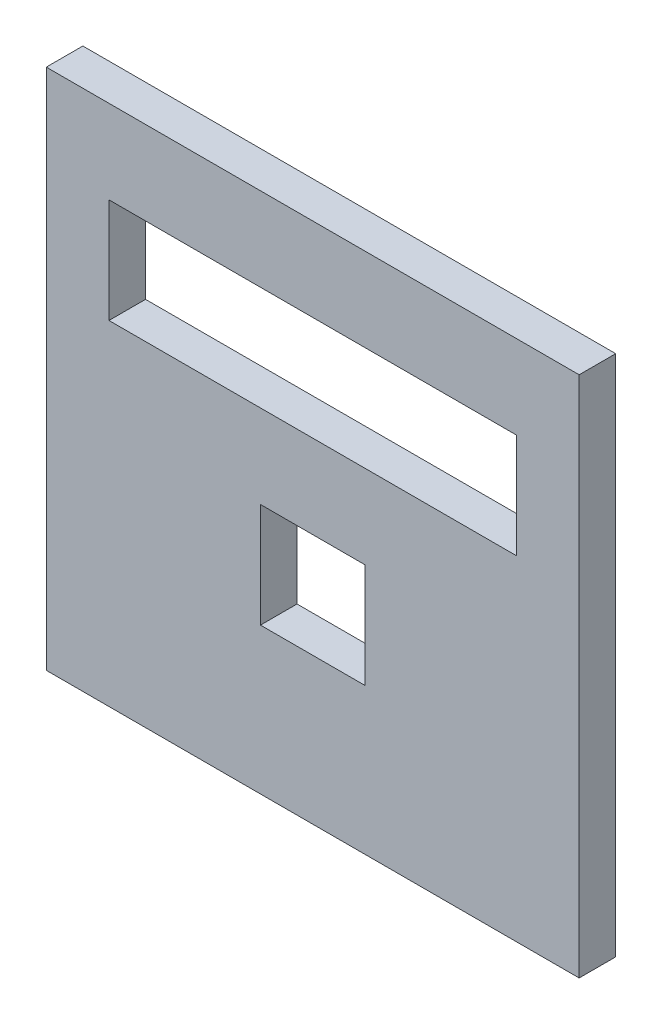
ISO-10303-21;
HEADER;
FILE_DESCRIPTION(('STEP AP214'),'2;1');
FILE_NAME('part.step','',(''),(''),'','','');
FILE_SCHEMA(('AUTOMOTIVE_DESIGN { 1 0 10303 214 1 1 1 1 }'));
ENDSEC;
DATA;
#1=APPLICATION_CONTEXT('core data for automotive mechanical design processes');
#2=APPLICATION_PROTOCOL_DEFINITION('international standard','automotive_design',2000,#1);
#3=PRODUCT_CONTEXT('',#1,'mechanical');
#4=PRODUCT('Part','Part','',(#3));
#5=PRODUCT_RELATED_PRODUCT_CATEGORY('part','',(#4));
#6=PRODUCT_DEFINITION_FORMATION('','',#4);
#7=PRODUCT_DEFINITION_CONTEXT('part definition',#1,'design');
#8=PRODUCT_DEFINITION('design','',#6,#7);
#9=PRODUCT_DEFINITION_SHAPE('','',#8);
#10=(LENGTH_UNIT() NAMED_UNIT(*) SI_UNIT(.MILLI.,.METRE.));
#11=(NAMED_UNIT(*) PLANE_ANGLE_UNIT() SI_UNIT($,.RADIAN.));
#12=(NAMED_UNIT(*) SI_UNIT($,.STERADIAN.) SOLID_ANGLE_UNIT());
#13=UNCERTAINTY_MEASURE_WITH_UNIT(LENGTH_MEASURE(1.E-05),#10,'distance_accuracy_value','');
#14=(GEOMETRIC_REPRESENTATION_CONTEXT(3) GLOBAL_UNCERTAINTY_ASSIGNED_CONTEXT((#13)) GLOBAL_UNIT_ASSIGNED_CONTEXT((#10,
#11,#12)) REPRESENTATION_CONTEXT('',''));
#15=CARTESIAN_POINT('',(0.,0.,0.));
#16=DIRECTION('',(0.,0.,1.));
#17=DIRECTION('',(1.,0.,0.));
#18=AXIS2_PLACEMENT_3D('',#15,#16,#17);
#19=CARTESIAN_POINT('',(0.,0.,1.75));
#20=DIRECTION('',(0.,0.,1.));
#21=DIRECTION('',(1.,0.,0.));
#22=AXIS2_PLACEMENT_3D('',#19,#20,#21);
#23=PLANE('',#22);
#24=DIRECTION('',(0.,1.,0.));
#25=VECTOR('',#24,1.);
#26=CARTESIAN_POINT('',(12.75,10.,1.75));
#27=LINE('',#26,#25);
#28=CARTESIAN_POINT('',(12.75,-10.,1.75));
#29=VERTEX_POINT('',#28);
#30=CARTESIAN_POINT('',(12.75,15.,1.75));
#31=VERTEX_POINT('',#30);
#32=EDGE_CURVE('E193',#29,#31,#27,.T.);
#33=ORIENTED_EDGE('',*,*,#32,.T.);
#34=DIRECTION('',(-1.,0.,0.));
#35=VECTOR('',#34,1.);
#36=CARTESIAN_POINT('',(12.75,15.,1.75));
#37=LINE('',#36,#35);
#38=CARTESIAN_POINT('',(-12.75,15.,1.75));
#39=VERTEX_POINT('',#38);
#40=EDGE_CURVE('E196',#31,#39,#37,.T.);
#41=ORIENTED_EDGE('',*,*,#40,.T.);
#42=DIRECTION('',(0.,-1.,0.));
#43=VECTOR('',#42,1.);
#44=CARTESIAN_POINT('',(-12.75,10.,1.75));
#45=LINE('',#44,#43);
#46=CARTESIAN_POINT('',(-12.75,-10.,1.75));
#47=VERTEX_POINT('',#46);
#48=EDGE_CURVE('E199',#39,#47,#45,.T.);
#49=ORIENTED_EDGE('',*,*,#48,.T.);
#50=DIRECTION('',(1.,0.,0.));
#51=VECTOR('',#50,1.);
#52=CARTESIAN_POINT('',(-12.75,-10.,1.75));
#53=LINE('',#52,#51);
#54=EDGE_CURVE('E201',#47,#29,#53,.T.);
#55=ORIENTED_EDGE('',*,*,#54,.T.);
#56=EDGE_LOOP('',(#33,#41,#49,#55));
#57=FACE_BOUND('',#56,.T.);
#58=DIRECTION('',(-1.,0.,0.));
#59=VECTOR('',#58,1.);
#60=CARTESIAN_POINT('',(-2.5,2.,1.75));
#61=LINE('',#60,#59);
#62=CARTESIAN_POINT('',(2.5,2.,1.75));
#63=VERTEX_POINT('',#62);
#64=CARTESIAN_POINT('',(-2.5,2.,1.75));
#65=VERTEX_POINT('',#64);
#66=EDGE_CURVE('E164',#63,#65,#61,.T.);
#67=ORIENTED_EDGE('',*,*,#66,.F.);
#68=DIRECTION('',(0.,1.,0.));
#69=VECTOR('',#68,1.);
#70=CARTESIAN_POINT('',(2.50000000000001,-3.,1.75));
#71=LINE('',#70,#69);
#72=CARTESIAN_POINT('',(2.50000000000001,-3.,1.75));
#73=VERTEX_POINT('',#72);
#74=EDGE_CURVE('E162',#73,#63,#71,.T.);
#75=ORIENTED_EDGE('',*,*,#74,.F.);
#76=DIRECTION('',(1.,0.,0.));
#77=VECTOR('',#76,1.);
#78=CARTESIAN_POINT('',(-2.5,-3.,1.75));
#79=LINE('',#78,#77);
#80=CARTESIAN_POINT('',(-2.5,-3.,1.75));
#81=VERTEX_POINT('',#80);
#82=EDGE_CURVE('E170',#81,#73,#79,.T.);
#83=ORIENTED_EDGE('',*,*,#82,.F.);
#84=DIRECTION('',(0.,-1.,0.));
#85=VECTOR('',#84,1.);
#86=CARTESIAN_POINT('',(-2.5,-3.,1.75));
#87=LINE('',#86,#85);
#88=EDGE_CURVE('E167',#65,#81,#87,.T.);
#89=ORIENTED_EDGE('',*,*,#88,.F.);
#90=EDGE_LOOP('',(#67,#75,#83,#89));
#91=FACE_BOUND('',#90,.T.);
#92=DIRECTION('',(-1.,0.,0.));
#93=VECTOR('',#92,1.);
#94=CARTESIAN_POINT('',(-9.75,11.,1.75));
#95=LINE('',#94,#93);
#96=CARTESIAN_POINT('',(9.75,11.,1.75));
#97=VERTEX_POINT('',#96);
#98=CARTESIAN_POINT('',(-9.75,11.,1.75));
#99=VERTEX_POINT('',#98);
#100=EDGE_CURVE('E134',#97,#99,#95,.T.);
#101=ORIENTED_EDGE('',*,*,#100,.F.);
#102=DIRECTION('',(0.,1.,0.));
#103=VECTOR('',#102,1.);
#104=CARTESIAN_POINT('',(9.75,11.,1.75));
#105=LINE('',#104,#103);
#106=CARTESIAN_POINT('',(9.75,6.,1.75));
#107=VERTEX_POINT('',#106);
#108=EDGE_CURVE('E126',#107,#97,#105,.T.);
#109=ORIENTED_EDGE('',*,*,#108,.F.);
#110=DIRECTION('',(1.,0.,0.));
#111=VECTOR('',#110,1.);
#112=CARTESIAN_POINT('',(-9.75,6.,1.75));
#113=LINE('',#112,#111);
#114=CARTESIAN_POINT('',(-9.75,6.,1.75));
#115=VERTEX_POINT('',#114);
#116=EDGE_CURVE('E148',#115,#107,#113,.T.);
#117=ORIENTED_EDGE('',*,*,#116,.F.);
#118=DIRECTION('',(0.,-1.,0.));
#119=VECTOR('',#118,1.);
#120=CARTESIAN_POINT('',(-9.75,11.,1.75));
#121=LINE('',#120,#119);
#122=EDGE_CURVE('E146',#99,#115,#121,.T.);
#123=ORIENTED_EDGE('',*,*,#122,.F.);
#124=EDGE_LOOP('',(#101,#109,#117,#123));
#125=FACE_BOUND('',#124,.T.);
#126=ADVANCED_FACE('F37',(#57,#91,#125),#23,.T.);
#127=CARTESIAN_POINT('',(0.,0.,0.));
#128=DIRECTION('',(0.,0.,1.));
#129=DIRECTION('',(1.,0.,0.));
#130=AXIS2_PLACEMENT_3D('',#127,#128,#129);
#131=PLANE('',#130);
#132=DIRECTION('',(0.,1.,0.));
#133=VECTOR('',#132,1.);
#134=CARTESIAN_POINT('',(2.50000000000001,-3.,0.));
#135=LINE('',#134,#133);
#136=CARTESIAN_POINT('',(2.50000000000001,-3.,0.));
#137=VERTEX_POINT('',#136);
#138=CARTESIAN_POINT('',(2.5,2.,0.));
#139=VERTEX_POINT('',#138);
#140=EDGE_CURVE('E142',#137,#139,#135,.T.);
#141=ORIENTED_EDGE('',*,*,#140,.T.);
#142=DIRECTION('',(-1.,0.,0.));
#143=VECTOR('',#142,1.);
#144=CARTESIAN_POINT('',(-2.5,2.,0.));
#145=LINE('',#144,#143);
#146=CARTESIAN_POINT('',(-2.5,2.,0.));
#147=VERTEX_POINT('',#146);
#148=EDGE_CURVE('E175',#139,#147,#145,.T.);
#149=ORIENTED_EDGE('',*,*,#148,.T.);
#150=DIRECTION('',(0.,-1.,0.));
#151=VECTOR('',#150,1.);
#152=CARTESIAN_POINT('',(-2.5,-3.,0.));
#153=LINE('',#152,#151);
#154=CARTESIAN_POINT('',(-2.5,-3.,0.));
#155=VERTEX_POINT('',#154);
#156=EDGE_CURVE('E178',#147,#155,#153,.T.);
#157=ORIENTED_EDGE('',*,*,#156,.T.);
#158=DIRECTION('',(1.,0.,0.));
#159=VECTOR('',#158,1.);
#160=CARTESIAN_POINT('',(-2.5,-3.,0.));
#161=LINE('',#160,#159);
#162=EDGE_CURVE('E165',#155,#137,#161,.T.);
#163=ORIENTED_EDGE('',*,*,#162,.T.);
#164=EDGE_LOOP('',(#141,#149,#157,#163));
#165=FACE_BOUND('',#164,.T.);
#166=DIRECTION('',(-1.,0.,0.));
#167=VECTOR('',#166,1.);
#168=CARTESIAN_POINT('',(-12.75,15.,0.));
#169=LINE('',#168,#167);
#170=CARTESIAN_POINT('',(12.75,15.,0.));
#171=VERTEX_POINT('',#170);
#172=CARTESIAN_POINT('',(-12.75,15.,0.));
#173=VERTEX_POINT('',#172);
#174=EDGE_CURVE('E192',#171,#173,#169,.T.);
#175=ORIENTED_EDGE('',*,*,#174,.F.);
#176=DIRECTION('',(0.,1.,0.));
#177=VECTOR('',#176,1.);
#178=CARTESIAN_POINT('',(12.75,-10.,0.));
#179=LINE('',#178,#177);
#180=CARTESIAN_POINT('',(12.75,-10.,0.));
#181=VERTEX_POINT('',#180);
#182=EDGE_CURVE('E197',#181,#171,#179,.T.);
#183=ORIENTED_EDGE('',*,*,#182,.F.);
#184=DIRECTION('',(1.,0.,0.));
#185=VECTOR('',#184,1.);
#186=CARTESIAN_POINT('',(-12.75,-10.,0.));
#187=LINE('',#186,#185);
#188=CARTESIAN_POINT('',(-12.75,-10.,0.));
#189=VERTEX_POINT('',#188);
#190=EDGE_CURVE('E209',#189,#181,#187,.T.);
#191=ORIENTED_EDGE('',*,*,#190,.F.);
#192=DIRECTION('',(0.,-1.,0.));
#193=VECTOR('',#192,1.);
#194=CARTESIAN_POINT('',(-12.75,-10.,0.));
#195=LINE('',#194,#193);
#196=EDGE_CURVE('E207',#173,#189,#195,.T.);
#197=ORIENTED_EDGE('',*,*,#196,.F.);
#198=EDGE_LOOP('',(#175,#183,#191,#197));
#199=FACE_BOUND('',#198,.T.);
#200=DIRECTION('',(0.,1.,0.));
#201=VECTOR('',#200,1.);
#202=CARTESIAN_POINT('',(9.75,11.,0.));
#203=LINE('',#202,#201);
#204=CARTESIAN_POINT('',(9.75,6.,0.));
#205=VERTEX_POINT('',#204);
#206=CARTESIAN_POINT('',(9.75,11.,0.));
#207=VERTEX_POINT('',#206);
#208=EDGE_CURVE('E60',#205,#207,#203,.T.);
#209=ORIENTED_EDGE('',*,*,#208,.T.);
#210=DIRECTION('',(-1.,0.,0.));
#211=VECTOR('',#210,1.);
#212=CARTESIAN_POINT('',(-9.75,11.,0.));
#213=LINE('',#212,#211);
#214=CARTESIAN_POINT('',(-9.75,11.,0.));
#215=VERTEX_POINT('',#214);
#216=EDGE_CURVE('E141',#207,#215,#213,.T.);
#217=ORIENTED_EDGE('',*,*,#216,.T.);
#218=DIRECTION('',(0.,-1.,0.));
#219=VECTOR('',#218,1.);
#220=CARTESIAN_POINT('',(-9.75,11.,0.));
#221=LINE('',#220,#219);
#222=CARTESIAN_POINT('',(-9.75,6.,0.));
#223=VERTEX_POINT('',#222);
#224=EDGE_CURVE('E154',#215,#223,#221,.T.);
#225=ORIENTED_EDGE('',*,*,#224,.T.);
#226=DIRECTION('',(1.,0.,0.));
#227=VECTOR('',#226,1.);
#228=CARTESIAN_POINT('',(-9.75,6.,0.));
#229=LINE('',#228,#227);
#230=EDGE_CURVE('E135',#223,#205,#229,.T.);
#231=ORIENTED_EDGE('',*,*,#230,.T.);
#232=EDGE_LOOP('',(#209,#217,#225,#231));
#233=FACE_BOUND('',#232,.T.);
#234=ADVANCED_FACE('F227',(#165,#199,#233),#131,.F.);
#235=CARTESIAN_POINT('',(-12.75,15.,1.75));
#236=DIRECTION('',(0.,-1.,0.));
#237=DIRECTION('',(1.,0.,0.));
#238=AXIS2_PLACEMENT_3D('',#235,#236,#237);
#239=PLANE('',#238);
#240=ORIENTED_EDGE('',*,*,#174,.T.);
#241=DIRECTION('',(0.,0.,-1.));
#242=VECTOR('',#241,1.);
#243=CARTESIAN_POINT('',(-12.75,15.,1.75));
#244=LINE('',#243,#242);
#245=EDGE_CURVE('E45',#39,#173,#244,.T.);
#246=ORIENTED_EDGE('',*,*,#245,.F.);
#247=ORIENTED_EDGE('',*,*,#40,.F.);
#248=DIRECTION('',(0.,0.,-1.));
#249=VECTOR('',#248,1.);
#250=CARTESIAN_POINT('',(12.75,15.,1.75));
#251=LINE('',#250,#249);
#252=EDGE_CURVE('E11',#31,#171,#251,.T.);
#253=ORIENTED_EDGE('',*,*,#252,.T.);
#254=EDGE_LOOP('',(#240,#246,#247,#253));
#255=FACE_BOUND('',#254,.T.);
#256=ADVANCED_FACE('F39',(#255),#239,.F.);
#257=CARTESIAN_POINT('',(-12.75,-10.,1.75));
#258=DIRECTION('',(1.,0.,0.));
#259=DIRECTION('',(0.,0.,-1.));
#260=AXIS2_PLACEMENT_3D('',#257,#258,#259);
#261=PLANE('',#260);
#262=ORIENTED_EDGE('',*,*,#196,.T.);
#263=DIRECTION('',(0.,0.,-1.));
#264=VECTOR('',#263,1.);
#265=CARTESIAN_POINT('',(-12.75,-10.,1.75));
#266=LINE('',#265,#264);
#267=EDGE_CURVE('E215',#47,#189,#266,.T.);
#268=ORIENTED_EDGE('',*,*,#267,.F.);
#269=ORIENTED_EDGE('',*,*,#48,.F.);
#270=ORIENTED_EDGE('',*,*,#245,.T.);
#271=EDGE_LOOP('',(#262,#268,#269,#270));
#272=FACE_BOUND('',#271,.T.);
#273=ADVANCED_FACE('F221',(#272),#261,.F.);
#274=CARTESIAN_POINT('',(-12.75,-10.,1.75));
#275=DIRECTION('',(0.,1.,0.));
#276=DIRECTION('',(0.,0.,1.));
#277=AXIS2_PLACEMENT_3D('',#274,#275,#276);
#278=PLANE('',#277);
#279=ORIENTED_EDGE('',*,*,#190,.T.);
#280=DIRECTION('',(0.,0.,-1.));
#281=VECTOR('',#280,1.);
#282=CARTESIAN_POINT('',(12.75,-10.,1.75));
#283=LINE('',#282,#281);
#284=EDGE_CURVE('E204',#29,#181,#283,.T.);
#285=ORIENTED_EDGE('',*,*,#284,.F.);
#286=ORIENTED_EDGE('',*,*,#54,.F.);
#287=ORIENTED_EDGE('',*,*,#267,.T.);
#288=EDGE_LOOP('',(#279,#285,#286,#287));
#289=FACE_BOUND('',#288,.T.);
#290=ADVANCED_FACE('F235',(#289),#278,.F.);
#291=CARTESIAN_POINT('',(12.75,-10.,1.75));
#292=DIRECTION('',(-1.,0.,0.));
#293=DIRECTION('',(0.,0.,1.));
#294=AXIS2_PLACEMENT_3D('',#291,#292,#293);
#295=PLANE('',#294);
#296=ORIENTED_EDGE('',*,*,#182,.T.);
#297=ORIENTED_EDGE('',*,*,#252,.F.);
#298=ORIENTED_EDGE('',*,*,#32,.F.);
#299=ORIENTED_EDGE('',*,*,#284,.T.);
#300=EDGE_LOOP('',(#296,#297,#298,#299));
#301=FACE_BOUND('',#300,.T.);
#302=ADVANCED_FACE('F231',(#301),#295,.F.);
#303=CARTESIAN_POINT('',(2.50000000000001,-3.,1.75));
#304=DIRECTION('',(-1.,0.,0.));
#305=DIRECTION('',(0.,-1.,0.));
#306=AXIS2_PLACEMENT_3D('',#303,#304,#305);
#307=PLANE('',#306);
#308=ORIENTED_EDGE('',*,*,#140,.F.);
#309=DIRECTION('',(0.,0.,-1.));
#310=VECTOR('',#309,1.);
#311=CARTESIAN_POINT('',(2.50000000000001,-3.,1.75));
#312=LINE('',#311,#310);
#313=EDGE_CURVE('E172',#73,#137,#312,.T.);
#314=ORIENTED_EDGE('',*,*,#313,.F.);
#315=ORIENTED_EDGE('',*,*,#74,.T.);
#316=DIRECTION('',(0.,0.,-1.));
#317=VECTOR('',#316,1.);
#318=CARTESIAN_POINT('',(2.5,2.,1.75));
#319=LINE('',#318,#317);
#320=EDGE_CURVE('E189',#63,#139,#319,.T.);
#321=ORIENTED_EDGE('',*,*,#320,.T.);
#322=EDGE_LOOP('',(#308,#314,#315,#321));
#323=FACE_BOUND('',#322,.T.);
#324=ADVANCED_FACE('F254',(#323),#307,.T.);
#325=CARTESIAN_POINT('',(-2.5,2.,1.75));
#326=DIRECTION('',(0.,-1.,0.));
#327=DIRECTION('',(1.,0.,0.));
#328=AXIS2_PLACEMENT_3D('',#325,#326,#327);
#329=PLANE('',#328);
#330=ORIENTED_EDGE('',*,*,#148,.F.);
#331=ORIENTED_EDGE('',*,*,#320,.F.);
#332=ORIENTED_EDGE('',*,*,#66,.T.);
#333=DIRECTION('',(0.,0.,-1.));
#334=VECTOR('',#333,1.);
#335=CARTESIAN_POINT('',(-2.5,2.,1.75));
#336=LINE('',#335,#334);
#337=EDGE_CURVE('E187',#65,#147,#336,.T.);
#338=ORIENTED_EDGE('',*,*,#337,.T.);
#339=EDGE_LOOP('',(#330,#331,#332,#338));
#340=FACE_BOUND('',#339,.T.);
#341=ADVANCED_FACE('F247',(#340),#329,.T.);
#342=CARTESIAN_POINT('',(-2.5,-3.,1.75));
#343=DIRECTION('',(1.,0.,0.));
#344=DIRECTION('',(0.,0.,-1.));
#345=AXIS2_PLACEMENT_3D('',#342,#343,#344);
#346=PLANE('',#345);
#347=ORIENTED_EDGE('',*,*,#156,.F.);
#348=ORIENTED_EDGE('',*,*,#337,.F.);
#349=ORIENTED_EDGE('',*,*,#88,.T.);
#350=DIRECTION('',(0.,0.,-1.));
#351=VECTOR('',#350,1.);
#352=CARTESIAN_POINT('',(-2.5,-3.,1.75));
#353=LINE('',#352,#351);
#354=EDGE_CURVE('E185',#81,#155,#353,.T.);
#355=ORIENTED_EDGE('',*,*,#354,.T.);
#356=EDGE_LOOP('',(#347,#348,#349,#355));
#357=FACE_BOUND('',#356,.T.);
#358=ADVANCED_FACE('F250',(#357),#346,.T.);
#359=CARTESIAN_POINT('',(-2.5,-3.,1.75));
#360=DIRECTION('',(0.,1.,0.));
#361=DIRECTION('',(-1.,0.,0.));
#362=AXIS2_PLACEMENT_3D('',#359,#360,#361);
#363=PLANE('',#362);
#364=ORIENTED_EDGE('',*,*,#162,.F.);
#365=ORIENTED_EDGE('',*,*,#354,.F.);
#366=ORIENTED_EDGE('',*,*,#82,.T.);
#367=ORIENTED_EDGE('',*,*,#313,.T.);
#368=EDGE_LOOP('',(#364,#365,#366,#367));
#369=FACE_BOUND('',#368,.T.);
#370=ADVANCED_FACE('F257',(#369),#363,.T.);
#371=CARTESIAN_POINT('',(9.75,11.,1.75));
#372=DIRECTION('',(-1.,0.,0.));
#373=DIRECTION('',(0.,-1.,0.));
#374=AXIS2_PLACEMENT_3D('',#371,#372,#373);
#375=PLANE('',#374);
#376=ORIENTED_EDGE('',*,*,#208,.F.);
#377=DIRECTION('',(0.,0.,-1.));
#378=VECTOR('',#377,1.);
#379=CARTESIAN_POINT('',(9.75,6.,1.75));
#380=LINE('',#379,#378);
#381=EDGE_CURVE('E130',#107,#205,#380,.T.);
#382=ORIENTED_EDGE('',*,*,#381,.F.);
#383=ORIENTED_EDGE('',*,*,#108,.T.);
#384=DIRECTION('',(0.,0.,-1.));
#385=VECTOR('',#384,1.);
#386=CARTESIAN_POINT('',(9.75,11.,1.75));
#387=LINE('',#386,#385);
#388=EDGE_CURVE('E129',#97,#207,#387,.T.);
#389=ORIENTED_EDGE('',*,*,#388,.T.);
#390=EDGE_LOOP('',(#376,#382,#383,#389));
#391=FACE_BOUND('',#390,.T.);
#392=ADVANCED_FACE('F128',(#391),#375,.T.);
#393=CARTESIAN_POINT('',(-9.75,11.,1.75));
#394=DIRECTION('',(0.,-1.,0.));
#395=DIRECTION('',(1.,0.,0.));
#396=AXIS2_PLACEMENT_3D('',#393,#394,#395);
#397=PLANE('',#396);
#398=ORIENTED_EDGE('',*,*,#216,.F.);
#399=ORIENTED_EDGE('',*,*,#388,.F.);
#400=ORIENTED_EDGE('',*,*,#100,.T.);
#401=DIRECTION('',(0.,0.,-1.));
#402=VECTOR('',#401,1.);
#403=CARTESIAN_POINT('',(-9.75,11.,1.75));
#404=LINE('',#403,#402);
#405=EDGE_CURVE('E143',#99,#215,#404,.T.);
#406=ORIENTED_EDGE('',*,*,#405,.T.);
#407=EDGE_LOOP('',(#398,#399,#400,#406));
#408=FACE_BOUND('',#407,.T.);
#409=ADVANCED_FACE('F138',(#408),#397,.T.);
#410=CARTESIAN_POINT('',(-9.75,11.,1.75));
#411=DIRECTION('',(1.,0.,0.));
#412=DIRECTION('',(0.,0.,-1.));
#413=AXIS2_PLACEMENT_3D('',#410,#411,#412);
#414=PLANE('',#413);
#415=ORIENTED_EDGE('',*,*,#224,.F.);
#416=ORIENTED_EDGE('',*,*,#405,.F.);
#417=ORIENTED_EDGE('',*,*,#122,.T.);
#418=DIRECTION('',(0.,0.,-1.));
#419=VECTOR('',#418,1.);
#420=CARTESIAN_POINT('',(-9.75,6.,1.75));
#421=LINE('',#420,#419);
#422=EDGE_CURVE('E52',#115,#223,#421,.T.);
#423=ORIENTED_EDGE('',*,*,#422,.T.);
#424=EDGE_LOOP('',(#415,#416,#417,#423));
#425=FACE_BOUND('',#424,.T.);
#426=ADVANCED_FACE('F378',(#425),#414,.T.);
#427=CARTESIAN_POINT('',(-9.75,6.,1.75));
#428=DIRECTION('',(0.,1.,0.));
#429=DIRECTION('',(-1.,0.,0.));
#430=AXIS2_PLACEMENT_3D('',#427,#428,#429);
#431=PLANE('',#430);
#432=ORIENTED_EDGE('',*,*,#230,.F.);
#433=ORIENTED_EDGE('',*,*,#422,.F.);
#434=ORIENTED_EDGE('',*,*,#116,.T.);
#435=ORIENTED_EDGE('',*,*,#381,.T.);
#436=EDGE_LOOP('',(#432,#433,#434,#435));
#437=FACE_BOUND('',#436,.T.);
#438=ADVANCED_FACE('F387',(#437),#431,.T.);
#439=CLOSED_SHELL('',(#126,#234,#256,#273,#290,#302,#324,#341,#358,#370,#392,#409,#426,#438));
#440=MANIFOLD_SOLID_BREP('B2',#439);
#441=ADVANCED_BREP_SHAPE_REPRESENTATION('',(#18,#440),#14);
#442=SHAPE_DEFINITION_REPRESENTATION(#9,#441);
ENDSEC;
END-ISO-10303-21;
